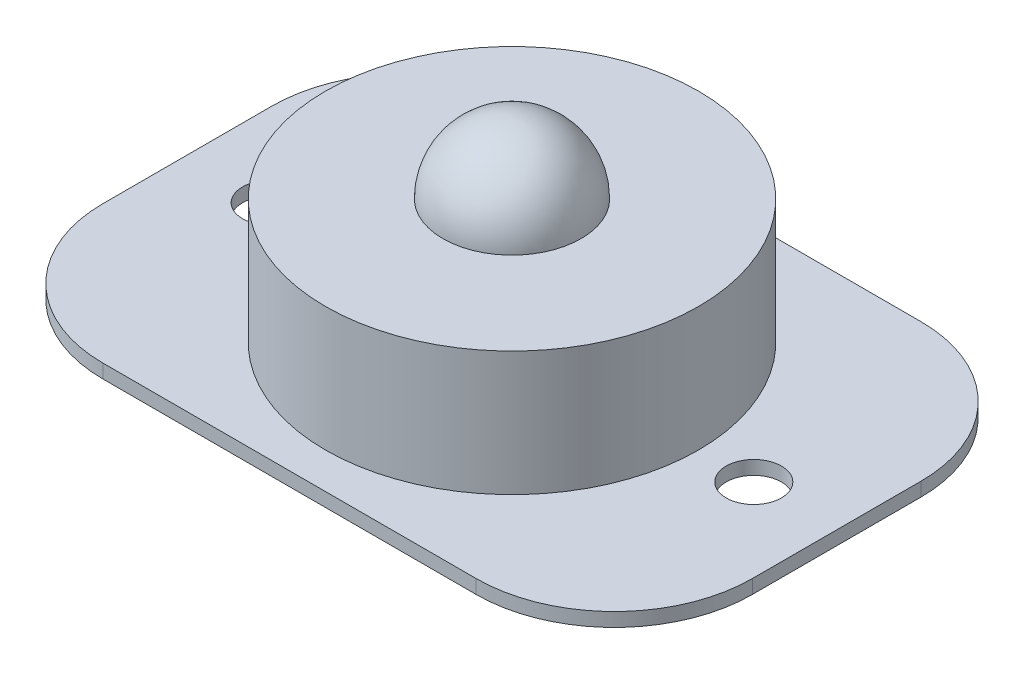
ISO-10303-21;
HEADER;
FILE_DESCRIPTION(('STEP AP214'),'2;1');
FILE_NAME('part.step','',(''),(''),'','','');
FILE_SCHEMA(('AUTOMOTIVE_DESIGN { 1 0 10303 214 1 1 1 1 }'));
ENDSEC;
DATA;
#1=APPLICATION_CONTEXT('core data for automotive mechanical design processes');
#2=APPLICATION_PROTOCOL_DEFINITION('international standard','automotive_design',2000,#1);
#3=PRODUCT_CONTEXT('',#1,'mechanical');
#4=PRODUCT('Part','Part','',(#3));
#5=PRODUCT_RELATED_PRODUCT_CATEGORY('part','',(#4));
#6=PRODUCT_DEFINITION_FORMATION('','',#4);
#7=PRODUCT_DEFINITION_CONTEXT('part definition',#1,'design');
#8=PRODUCT_DEFINITION('design','',#6,#7);
#9=PRODUCT_DEFINITION_SHAPE('','',#8);
#10=(LENGTH_UNIT() NAMED_UNIT(*) SI_UNIT(.MILLI.,.METRE.));
#11=(NAMED_UNIT(*) PLANE_ANGLE_UNIT() SI_UNIT($,.RADIAN.));
#12=(NAMED_UNIT(*) SI_UNIT($,.STERADIAN.) SOLID_ANGLE_UNIT());
#13=UNCERTAINTY_MEASURE_WITH_UNIT(LENGTH_MEASURE(1.E-05),#10,'distance_accuracy_value','');
#14=(GEOMETRIC_REPRESENTATION_CONTEXT(3) GLOBAL_UNCERTAINTY_ASSIGNED_CONTEXT((#13)) GLOBAL_UNIT_ASSIGNED_CONTEXT((#10,
#11,#12)) REPRESENTATION_CONTEXT('',''));
#15=CARTESIAN_POINT('',(0.,0.,0.));
#16=DIRECTION('',(0.,0.,1.));
#17=DIRECTION('',(1.,0.,0.));
#18=AXIS2_PLACEMENT_3D('',#15,#16,#17);
#19=CARTESIAN_POINT('',(0.,1.,16.1));
#20=DIRECTION('',(0.,0.,-1.));
#21=DIRECTION('',(-1.,0.,0.));
#22=AXIS2_PLACEMENT_3D('',#19,#20,#21);
#23=PLANE('',#22);
#24=DIRECTION('',(1.,0.,0.));
#25=VECTOR('',#24,1.);
#26=CARTESIAN_POINT('',(0.,0.,16.1));
#27=LINE('',#26,#25);
#28=CARTESIAN_POINT('',(-13.5,0.,16.1));
#29=VERTEX_POINT('',#28);
#30=CARTESIAN_POINT('',(13.5,0.,16.1));
#31=VERTEX_POINT('',#30);
#32=EDGE_CURVE('E163',#29,#31,#27,.T.);
#33=ORIENTED_EDGE('',*,*,#32,.T.);
#34=DIRECTION('',(0.,-1.,0.));
#35=VECTOR('',#34,1.);
#36=CARTESIAN_POINT('',(13.5,1.,16.1));
#37=LINE('',#36,#35);
#38=CARTESIAN_POINT('',(13.5,1.,16.1));
#39=VERTEX_POINT('',#38);
#40=EDGE_CURVE('E154',#31,#39,#37,.F.);
#41=ORIENTED_EDGE('',*,*,#40,.T.);
#42=DIRECTION('',(1.,0.,0.));
#43=VECTOR('',#42,1.);
#44=CARTESIAN_POINT('',(0.,1.,16.1));
#45=LINE('',#44,#43);
#46=CARTESIAN_POINT('',(-13.5,1.,16.1));
#47=VERTEX_POINT('',#46);
#48=EDGE_CURVE('E181',#47,#39,#45,.T.);
#49=ORIENTED_EDGE('',*,*,#48,.F.);
#50=DIRECTION('',(0.,-1.,0.));
#51=VECTOR('',#50,1.);
#52=CARTESIAN_POINT('',(-13.5,0.,16.1));
#53=LINE('',#52,#51);
#54=EDGE_CURVE('E151',#47,#29,#53,.T.);
#55=ORIENTED_EDGE('',*,*,#54,.T.);
#56=EDGE_LOOP('',(#33,#41,#49,#55));
#57=FACE_BOUND('',#56,.T.);
#58=ADVANCED_FACE('F41',(#57),#23,.F.);
#59=CARTESIAN_POINT('',(23.5,1.,0.));
#60=DIRECTION('',(-1.,0.,0.));
#61=DIRECTION('',(0.,0.,1.));
#62=AXIS2_PLACEMENT_3D('',#59,#60,#61);
#63=PLANE('',#62);
#64=DIRECTION('',(0.,0.,-1.));
#65=VECTOR('',#64,1.);
#66=CARTESIAN_POINT('',(23.5,0.,0.));
#67=LINE('',#66,#65);
#68=CARTESIAN_POINT('',(23.5,0.,6.1));
#69=VERTEX_POINT('',#68);
#70=CARTESIAN_POINT('',(23.5,0.,-6.1));
#71=VERTEX_POINT('',#70);
#72=EDGE_CURVE('E124',#69,#71,#67,.T.);
#73=ORIENTED_EDGE('',*,*,#72,.T.);
#74=DIRECTION('',(0.,-1.,0.));
#75=VECTOR('',#74,1.);
#76=CARTESIAN_POINT('',(23.5,1.,-6.1));
#77=LINE('',#76,#75);
#78=CARTESIAN_POINT('',(23.5,1.,-6.1));
#79=VERTEX_POINT('',#78);
#80=EDGE_CURVE('E142',#71,#79,#77,.F.);
#81=ORIENTED_EDGE('',*,*,#80,.T.);
#82=DIRECTION('',(0.,0.,-1.));
#83=VECTOR('',#82,1.);
#84=CARTESIAN_POINT('',(23.5,1.,0.));
#85=LINE('',#84,#83);
#86=CARTESIAN_POINT('',(23.5,1.,6.1));
#87=VERTEX_POINT('',#86);
#88=EDGE_CURVE('E159',#87,#79,#85,.T.);
#89=ORIENTED_EDGE('',*,*,#88,.F.);
#90=DIRECTION('',(0.,-1.,0.));
#91=VECTOR('',#90,1.);
#92=CARTESIAN_POINT('',(23.5,1.,6.1));
#93=LINE('',#92,#91);
#94=EDGE_CURVE('E139',#87,#69,#93,.T.);
#95=ORIENTED_EDGE('',*,*,#94,.T.);
#96=EDGE_LOOP('',(#73,#81,#89,#95));
#97=FACE_BOUND('',#96,.T.);
#98=ADVANCED_FACE('F171',(#97),#63,.F.);
#99=CARTESIAN_POINT('',(0.,1.,-16.1));
#100=DIRECTION('',(0.,0.,-1.));
#101=DIRECTION('',(-1.,0.,0.));
#102=AXIS2_PLACEMENT_3D('',#99,#100,#101);
#103=PLANE('',#102);
#104=DIRECTION('',(1.,0.,0.));
#105=VECTOR('',#104,1.);
#106=CARTESIAN_POINT('',(0.,1.,-16.1));
#107=LINE('',#106,#105);
#108=CARTESIAN_POINT('',(-13.5,1.,-16.1));
#109=VERTEX_POINT('',#108);
#110=CARTESIAN_POINT('',(13.5,1.,-16.1));
#111=VERTEX_POINT('',#110);
#112=EDGE_CURVE('E157',#109,#111,#107,.T.);
#113=ORIENTED_EDGE('',*,*,#112,.T.);
#114=DIRECTION('',(0.,-1.,0.));
#115=VECTOR('',#114,1.);
#116=CARTESIAN_POINT('',(13.5,0.,-16.1));
#117=LINE('',#116,#115);
#118=CARTESIAN_POINT('',(13.5,0.,-16.1));
#119=VERTEX_POINT('',#118);
#120=EDGE_CURVE('E116',#111,#119,#117,.T.);
#121=ORIENTED_EDGE('',*,*,#120,.T.);
#122=DIRECTION('',(1.,0.,0.));
#123=VECTOR('',#122,1.);
#124=CARTESIAN_POINT('',(0.,0.,-16.1));
#125=LINE('',#124,#123);
#126=CARTESIAN_POINT('',(-13.5,0.,-16.1));
#127=VERTEX_POINT('',#126);
#128=EDGE_CURVE('E109',#127,#119,#125,.T.);
#129=ORIENTED_EDGE('',*,*,#128,.F.);
#130=DIRECTION('',(0.,-1.,0.));
#131=VECTOR('',#130,1.);
#132=CARTESIAN_POINT('',(-13.5,1.,-16.1));
#133=LINE('',#132,#131);
#134=EDGE_CURVE('E122',#127,#109,#133,.F.);
#135=ORIENTED_EDGE('',*,*,#134,.T.);
#136=EDGE_LOOP('',(#113,#121,#129,#135));
#137=FACE_BOUND('',#136,.T.);
#138=ADVANCED_FACE('F121',(#137),#103,.T.);
#139=CARTESIAN_POINT('',(-23.5,1.,0.));
#140=DIRECTION('',(-1.,0.,0.));
#141=DIRECTION('',(0.,0.,1.));
#142=AXIS2_PLACEMENT_3D('',#139,#140,#141);
#143=PLANE('',#142);
#144=DIRECTION('',(0.,0.,-1.));
#145=VECTOR('',#144,1.);
#146=CARTESIAN_POINT('',(-23.5,0.,0.));
#147=LINE('',#146,#145);
#148=CARTESIAN_POINT('',(-23.5,0.,6.1));
#149=VERTEX_POINT('',#148);
#150=CARTESIAN_POINT('',(-23.5,0.,-6.1));
#151=VERTEX_POINT('',#150);
#152=EDGE_CURVE('E110',#149,#151,#147,.T.);
#153=ORIENTED_EDGE('',*,*,#152,.F.);
#154=DIRECTION('',(0.,-1.,0.));
#155=VECTOR('',#154,1.);
#156=CARTESIAN_POINT('',(-23.5,1.,6.1));
#157=LINE('',#156,#155);
#158=CARTESIAN_POINT('',(-23.5,1.,6.1));
#159=VERTEX_POINT('',#158);
#160=EDGE_CURVE('E11',#149,#159,#157,.F.);
#161=ORIENTED_EDGE('',*,*,#160,.T.);
#162=DIRECTION('',(0.,0.,-1.));
#163=VECTOR('',#162,1.);
#164=CARTESIAN_POINT('',(-23.5,1.,0.));
#165=LINE('',#164,#163);
#166=CARTESIAN_POINT('',(-23.5,1.,-6.1));
#167=VERTEX_POINT('',#166);
#168=EDGE_CURVE('E130',#159,#167,#165,.T.);
#169=ORIENTED_EDGE('',*,*,#168,.T.);
#170=DIRECTION('',(0.,-1.,0.));
#171=VECTOR('',#170,1.);
#172=CARTESIAN_POINT('',(-23.5,1.,-6.1));
#173=LINE('',#172,#171);
#174=EDGE_CURVE('E49',#167,#151,#173,.T.);
#175=ORIENTED_EDGE('',*,*,#174,.T.);
#176=EDGE_LOOP('',(#153,#161,#169,#175));
#177=FACE_BOUND('',#176,.T.);
#178=ADVANCED_FACE('F155',(#177),#143,.T.);
#179=CARTESIAN_POINT('',(0.,1.,0.));
#180=DIRECTION('',(0.,1.,0.));
#181=DIRECTION('',(0.,0.,1.));
#182=AXIS2_PLACEMENT_3D('',#179,#180,#181);
#183=PLANE('',#182);
#184=CARTESIAN_POINT('',(-17.5,1.,0.));
#185=DIRECTION('',(0.,1.,0.));
#186=DIRECTION('',(0.,0.,1.));
#187=AXIS2_PLACEMENT_3D('',#184,#185,#186);
#188=CIRCLE('',#187,2.00000000000001);
#189=CARTESIAN_POINT('',(-17.5,1.,2.00000000000002));
#190=VERTEX_POINT('',#189);
#191=EDGE_CURVE('E198',#190,#190,#188,.T.);
#192=ORIENTED_EDGE('',*,*,#191,.F.);
#193=EDGE_LOOP('',(#192));
#194=FACE_BOUND('',#193,.T.);
#195=CARTESIAN_POINT('',(17.5,1.,0.));
#196=DIRECTION('',(0.,1.,0.));
#197=DIRECTION('',(0.,0.,1.));
#198=AXIS2_PLACEMENT_3D('',#195,#196,#197);
#199=CIRCLE('',#198,2.00000000000001);
#200=CARTESIAN_POINT('',(17.5,1.,2.00000000000001));
#201=VERTEX_POINT('',#200);
#202=EDGE_CURVE('E192',#201,#201,#199,.T.);
#203=ORIENTED_EDGE('',*,*,#202,.F.);
#204=EDGE_LOOP('',(#203));
#205=FACE_BOUND('',#204,.T.);
#206=CARTESIAN_POINT('',(0.,1.,0.));
#207=DIRECTION('',(0.,1.,0.));
#208=DIRECTION('',(0.,0.,1.));
#209=AXIS2_PLACEMENT_3D('',#206,#207,#208);
#210=CIRCLE('',#209,13.5);
#211=CARTESIAN_POINT('',(0.,1.,13.5));
#212=VERTEX_POINT('',#211);
#213=EDGE_CURVE('E126',#212,#212,#210,.T.);
#214=ORIENTED_EDGE('',*,*,#213,.F.);
#215=EDGE_LOOP('',(#214));
#216=FACE_BOUND('',#215,.T.);
#217=ORIENTED_EDGE('',*,*,#88,.T.);
#218=CARTESIAN_POINT('',(13.5,1.,-6.1));
#219=DIRECTION('',(0.,1.,0.));
#220=DIRECTION('',(0.,0.,1.));
#221=AXIS2_PLACEMENT_3D('',#218,#219,#220);
#222=CIRCLE('',#221,10.);
#223=EDGE_CURVE('E149',#79,#111,#222,.T.);
#224=ORIENTED_EDGE('',*,*,#223,.T.);
#225=ORIENTED_EDGE('',*,*,#112,.F.);
#226=CARTESIAN_POINT('',(-13.5,1.,-6.1));
#227=DIRECTION('',(0.,1.,0.));
#228=DIRECTION('',(0.,0.,1.));
#229=AXIS2_PLACEMENT_3D('',#226,#227,#228);
#230=CIRCLE('',#229,10.);
#231=EDGE_CURVE('E56',#109,#167,#230,.T.);
#232=ORIENTED_EDGE('',*,*,#231,.T.);
#233=ORIENTED_EDGE('',*,*,#168,.F.);
#234=CARTESIAN_POINT('',(-13.5,1.,6.1));
#235=DIRECTION('',(0.,1.,0.));
#236=DIRECTION('',(0.,0.,1.));
#237=AXIS2_PLACEMENT_3D('',#234,#235,#236);
#238=CIRCLE('',#237,10.);
#239=EDGE_CURVE('E145',#159,#47,#238,.T.);
#240=ORIENTED_EDGE('',*,*,#239,.T.);
#241=ORIENTED_EDGE('',*,*,#48,.T.);
#242=CARTESIAN_POINT('',(13.5,1.,6.1));
#243=DIRECTION('',(0.,1.,0.));
#244=DIRECTION('',(0.,0.,1.));
#245=AXIS2_PLACEMENT_3D('',#242,#243,#244);
#246=CIRCLE('',#245,10.);
#247=EDGE_CURVE('E147',#39,#87,#246,.T.);
#248=ORIENTED_EDGE('',*,*,#247,.T.);
#249=EDGE_LOOP('',(#217,#224,#225,#232,#233,#240,#241,#248));
#250=FACE_BOUND('',#249,.T.);
#251=ADVANCED_FACE('F178',(#194,#205,#216,#250),#183,.T.);
#252=CARTESIAN_POINT('',(0.,0.,0.));
#253=DIRECTION('',(0.,1.,0.));
#254=DIRECTION('',(0.,0.,1.));
#255=AXIS2_PLACEMENT_3D('',#252,#253,#254);
#256=PLANE('',#255);
#257=CARTESIAN_POINT('',(-17.5,0.,0.));
#258=DIRECTION('',(0.,1.,0.));
#259=DIRECTION('',(0.,0.,1.));
#260=AXIS2_PLACEMENT_3D('',#257,#258,#259);
#261=CIRCLE('',#260,2.00000000000001);
#262=CARTESIAN_POINT('',(-17.5,0.,2.00000000000002));
#263=VERTEX_POINT('',#262);
#264=EDGE_CURVE('E195',#263,#263,#261,.T.);
#265=ORIENTED_EDGE('',*,*,#264,.T.);
#266=EDGE_LOOP('',(#265));
#267=FACE_BOUND('',#266,.T.);
#268=CARTESIAN_POINT('',(17.5,0.,0.));
#269=DIRECTION('',(0.,1.,0.));
#270=DIRECTION('',(0.,0.,1.));
#271=AXIS2_PLACEMENT_3D('',#268,#269,#270);
#272=CIRCLE('',#271,2.00000000000001);
#273=CARTESIAN_POINT('',(17.5,0.,2.00000000000001));
#274=VERTEX_POINT('',#273);
#275=EDGE_CURVE('E189',#274,#274,#272,.T.);
#276=ORIENTED_EDGE('',*,*,#275,.T.);
#277=EDGE_LOOP('',(#276));
#278=FACE_BOUND('',#277,.T.);
#279=ORIENTED_EDGE('',*,*,#128,.T.);
#280=CARTESIAN_POINT('',(13.5,0.,-6.1));
#281=DIRECTION('',(0.,1.,0.));
#282=DIRECTION('',(0.,0.,1.));
#283=AXIS2_PLACEMENT_3D('',#280,#281,#282);
#284=CIRCLE('',#283,10.);
#285=EDGE_CURVE('E137',#119,#71,#284,.F.);
#286=ORIENTED_EDGE('',*,*,#285,.T.);
#287=ORIENTED_EDGE('',*,*,#72,.F.);
#288=CARTESIAN_POINT('',(13.5,0.,6.1));
#289=DIRECTION('',(0.,1.,0.));
#290=DIRECTION('',(0.,0.,1.));
#291=AXIS2_PLACEMENT_3D('',#288,#289,#290);
#292=CIRCLE('',#291,10.);
#293=EDGE_CURVE('E135',#69,#31,#292,.F.);
#294=ORIENTED_EDGE('',*,*,#293,.T.);
#295=ORIENTED_EDGE('',*,*,#32,.F.);
#296=CARTESIAN_POINT('',(-13.5,0.,6.1));
#297=DIRECTION('',(0.,1.,0.));
#298=DIRECTION('',(0.,0.,1.));
#299=AXIS2_PLACEMENT_3D('',#296,#297,#298);
#300=CIRCLE('',#299,10.);
#301=EDGE_CURVE('E115',#29,#149,#300,.F.);
#302=ORIENTED_EDGE('',*,*,#301,.T.);
#303=ORIENTED_EDGE('',*,*,#152,.T.);
#304=CARTESIAN_POINT('',(-13.5,0.,-6.1));
#305=DIRECTION('',(0.,1.,0.));
#306=DIRECTION('',(0.,0.,1.));
#307=AXIS2_PLACEMENT_3D('',#304,#305,#306);
#308=CIRCLE('',#307,10.);
#309=EDGE_CURVE('E106',#151,#127,#308,.F.);
#310=ORIENTED_EDGE('',*,*,#309,.T.);
#311=EDGE_LOOP('',(#279,#286,#287,#294,#295,#302,#303,#310));
#312=FACE_BOUND('',#311,.T.);
#313=ADVANCED_FACE('F108',(#267,#278,#312),#256,.F.);
#314=CARTESIAN_POINT('',(0.,10.,0.));
#315=DIRECTION('',(0.,-1.,0.));
#316=DIRECTION('',(0.,0.,-1.));
#317=AXIS2_PLACEMENT_3D('',#314,#315,#316);
#318=CYLINDRICAL_SURFACE('',#317,13.5);
#319=CARTESIAN_POINT('',(0.,10.,0.));
#320=DIRECTION('',(0.,1.,0.));
#321=DIRECTION('',(0.,0.,1.));
#322=AXIS2_PLACEMENT_3D('',#319,#320,#321);
#323=CIRCLE('',#322,13.5);
#324=CARTESIAN_POINT('',(0.,10.,13.5));
#325=VERTEX_POINT('',#324);
#326=EDGE_CURVE('E166',#325,#325,#323,.T.);
#327=ORIENTED_EDGE('',*,*,#326,.F.);
#328=EDGE_LOOP('',(#327));
#329=FACE_BOUND('',#328,.T.);
#330=ORIENTED_EDGE('',*,*,#213,.T.);
#331=EDGE_LOOP('',(#330));
#332=FACE_BOUND('',#331,.T.);
#333=ADVANCED_FACE('F211',(#329,#332),#318,.T.);
#334=CARTESIAN_POINT('',(0.,10.,0.));
#335=DIRECTION('',(0.,1.,0.));
#336=DIRECTION('',(0.,0.,1.));
#337=AXIS2_PLACEMENT_3D('',#334,#335,#336);
#338=PLANE('',#337);
#339=CARTESIAN_POINT('',(0.,10.,0.));
#340=DIRECTION('',(0.,1.,0.));
#341=DIRECTION('',(0.,0.,1.));
#342=AXIS2_PLACEMENT_3D('',#339,#340,#341);
#343=CIRCLE('',#342,5.);
#344=CARTESIAN_POINT('',(0.,10.,5.));
#345=VERTEX_POINT('',#344);
#346=EDGE_CURVE('E186',#345,#345,#343,.T.);
#347=ORIENTED_EDGE('',*,*,#346,.F.);
#348=EDGE_LOOP('',(#347));
#349=FACE_BOUND('',#348,.T.);
#350=ORIENTED_EDGE('',*,*,#326,.T.);
#351=EDGE_LOOP('',(#350));
#352=FACE_BOUND('',#351,.T.);
#353=ADVANCED_FACE('F213',(#349,#352),#338,.T.);
#354=CARTESIAN_POINT('',(0.,10.,0.));
#355=DIRECTION('',(0.,1.,0.));
#356=DIRECTION('',(0.,0.,1.));
#357=AXIS2_PLACEMENT_3D('',#354,#355,#356);
#358=SPHERICAL_SURFACE('',#357,5.);
#359=ORIENTED_EDGE('',*,*,#346,.T.);
#360=EDGE_LOOP('',(#359));
#361=FACE_BOUND('',#360,.T.);
#362=ADVANCED_FACE('F219',(#361),#358,.T.);
#363=CARTESIAN_POINT('',(17.5,1.,0.));
#364=DIRECTION('',(0.,1.,0.));
#365=DIRECTION('',(0.,0.,1.));
#366=AXIS2_PLACEMENT_3D('',#363,#364,#365);
#367=CYLINDRICAL_SURFACE('',#366,2.00000000000001);
#368=ORIENTED_EDGE('',*,*,#275,.F.);
#369=EDGE_LOOP('',(#368));
#370=FACE_BOUND('',#369,.T.);
#371=ORIENTED_EDGE('',*,*,#202,.T.);
#372=EDGE_LOOP('',(#371));
#373=FACE_BOUND('',#372,.T.);
#374=ADVANCED_FACE('F278',(#370,#373),#367,.F.);
#375=CARTESIAN_POINT('',(-17.5,1.,0.));
#376=DIRECTION('',(0.,1.,0.));
#377=DIRECTION('',(0.,0.,1.));
#378=AXIS2_PLACEMENT_3D('',#375,#376,#377);
#379=CYLINDRICAL_SURFACE('',#378,2.00000000000001);
#380=ORIENTED_EDGE('',*,*,#264,.F.);
#381=EDGE_LOOP('',(#380));
#382=FACE_BOUND('',#381,.T.);
#383=ORIENTED_EDGE('',*,*,#191,.T.);
#384=EDGE_LOOP('',(#383));
#385=FACE_BOUND('',#384,.T.);
#386=ADVANCED_FACE('F202',(#382,#385),#379,.F.);
#387=CARTESIAN_POINT('',(13.5,1.,-6.1));
#388=DIRECTION('',(0.,1.,0.));
#389=DIRECTION('',(0.,0.,1.));
#390=AXIS2_PLACEMENT_3D('',#387,#388,#389);
#391=CYLINDRICAL_SURFACE('',#390,10.);
#392=ORIENTED_EDGE('',*,*,#223,.F.);
#393=ORIENTED_EDGE('',*,*,#80,.F.);
#394=ORIENTED_EDGE('',*,*,#285,.F.);
#395=ORIENTED_EDGE('',*,*,#120,.F.);
#396=EDGE_LOOP('',(#392,#393,#394,#395));
#397=FACE_BOUND('',#396,.T.);
#398=ADVANCED_FACE('F177',(#397),#391,.T.);
#399=CARTESIAN_POINT('',(13.5,1.,6.1));
#400=DIRECTION('',(0.,-1.,0.));
#401=DIRECTION('',(0.,0.,-1.));
#402=AXIS2_PLACEMENT_3D('',#399,#400,#401);
#403=CYLINDRICAL_SURFACE('',#402,10.);
#404=ORIENTED_EDGE('',*,*,#247,.F.);
#405=ORIENTED_EDGE('',*,*,#40,.F.);
#406=ORIENTED_EDGE('',*,*,#293,.F.);
#407=ORIENTED_EDGE('',*,*,#94,.F.);
#408=EDGE_LOOP('',(#404,#405,#406,#407));
#409=FACE_BOUND('',#408,.T.);
#410=ADVANCED_FACE('F238',(#409),#403,.T.);
#411=CARTESIAN_POINT('',(-13.5,1.,6.1));
#412=DIRECTION('',(0.,1.,0.));
#413=DIRECTION('',(0.,0.,1.));
#414=AXIS2_PLACEMENT_3D('',#411,#412,#413);
#415=CYLINDRICAL_SURFACE('',#414,10.);
#416=ORIENTED_EDGE('',*,*,#239,.F.);
#417=ORIENTED_EDGE('',*,*,#160,.F.);
#418=ORIENTED_EDGE('',*,*,#301,.F.);
#419=ORIENTED_EDGE('',*,*,#54,.F.);
#420=EDGE_LOOP('',(#416,#417,#418,#419));
#421=FACE_BOUND('',#420,.T.);
#422=ADVANCED_FACE('F240',(#421),#415,.T.);
#423=CARTESIAN_POINT('',(-13.5,1.,-6.1));
#424=DIRECTION('',(0.,-1.,0.));
#425=DIRECTION('',(0.,0.,-1.));
#426=AXIS2_PLACEMENT_3D('',#423,#424,#425);
#427=CYLINDRICAL_SURFACE('',#426,10.);
#428=ORIENTED_EDGE('',*,*,#231,.F.);
#429=ORIENTED_EDGE('',*,*,#134,.F.);
#430=ORIENTED_EDGE('',*,*,#309,.F.);
#431=ORIENTED_EDGE('',*,*,#174,.F.);
#432=EDGE_LOOP('',(#428,#429,#430,#431));
#433=FACE_BOUND('',#432,.T.);
#434=ADVANCED_FACE('F43',(#433),#427,.T.);
#435=CLOSED_SHELL('',(#58,#98,#138,#178,#251,#313,#333,#353,#362,#374,#386,#398,#410,#422,#434));
#436=MANIFOLD_SOLID_BREP('B2',#435);
#437=ADVANCED_BREP_SHAPE_REPRESENTATION('',(#18,#436),#14);
#438=SHAPE_DEFINITION_REPRESENTATION(#9,#437);
ENDSEC;
END-ISO-10303-21;
